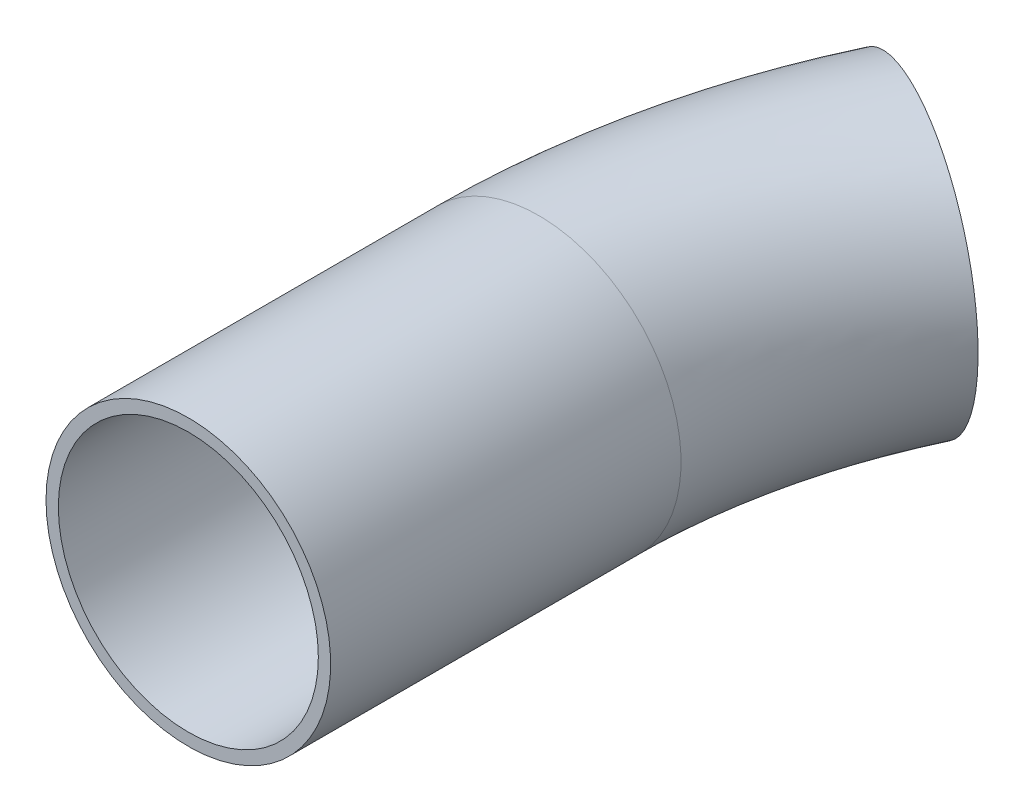
ISO-10303-21;
HEADER;
FILE_DESCRIPTION(('STEP AP214'),'2;1');
FILE_NAME('part.step','',(''),(''),'','','');
FILE_SCHEMA(('AUTOMOTIVE_DESIGN { 1 0 10303 214 1 1 1 1 }'));
ENDSEC;
DATA;
#1=APPLICATION_CONTEXT('core data for automotive mechanical design processes');
#2=APPLICATION_PROTOCOL_DEFINITION('international standard','automotive_design',2000,#1);
#3=PRODUCT_CONTEXT('',#1,'mechanical');
#4=PRODUCT('Part','Part','',(#3));
#5=PRODUCT_RELATED_PRODUCT_CATEGORY('part','',(#4));
#6=PRODUCT_DEFINITION_FORMATION('','',#4);
#7=PRODUCT_DEFINITION_CONTEXT('part definition',#1,'design');
#8=PRODUCT_DEFINITION('design','',#6,#7);
#9=PRODUCT_DEFINITION_SHAPE('','',#8);
#10=(LENGTH_UNIT() NAMED_UNIT(*) SI_UNIT(.MILLI.,.METRE.));
#11=(NAMED_UNIT(*) PLANE_ANGLE_UNIT() SI_UNIT($,.RADIAN.));
#12=(NAMED_UNIT(*) SI_UNIT($,.STERADIAN.) SOLID_ANGLE_UNIT());
#13=UNCERTAINTY_MEASURE_WITH_UNIT(LENGTH_MEASURE(1.E-05),#10,'distance_accuracy_value','');
#14=(GEOMETRIC_REPRESENTATION_CONTEXT(3) GLOBAL_UNCERTAINTY_ASSIGNED_CONTEXT((#13)) GLOBAL_UNIT_ASSIGNED_CONTEXT((#10,
#11,#12)) REPRESENTATION_CONTEXT('',''));
#15=CARTESIAN_POINT('',(0.,0.,0.));
#16=DIRECTION('',(0.,0.,1.));
#17=DIRECTION('',(1.,0.,0.));
#18=AXIS2_PLACEMENT_3D('',#15,#16,#17);
#19=CARTESIAN_POINT('',(95.7028457504537,0.,-72.2914605826834));
#20=DIRECTION('',(0.,-1.,0.));
#21=DIRECTION('',(0.,0.,-1.));
#22=AXIS2_PLACEMENT_3D('',#19,#20,#21);
#23=TOROIDAL_SURFACE('',#22,95.7028457504537,19.05);
#24=CARTESIAN_POINT('',(0.,0.,-72.2914605826834));
#25=DIRECTION('',(0.,0.,-1.));
#26=DIRECTION('',(-1.,0.,0.));
#27=AXIS2_PLACEMENT_3D('',#24,#25,#26);
#28=CIRCLE('',#27,19.05);
#29=CARTESIAN_POINT('',(-19.05,0.,-72.2914605826834));
#30=VERTEX_POINT('',#29);
#31=EDGE_CURVE('E44',#30,#30,#28,.T.);
#32=CARTESIAN_POINT('',(9.03733466226704,0.,-112.888552505117));
#33=DIRECTION('',(0.424199422745391,0.,-0.905568799011139));
#34=DIRECTION('',(-0.905568799011139,0.,-0.424199422745391));
#35=AXIS2_PLACEMENT_3D('',#32,#33,#34);
#36=CIRCLE('',#35,19.05);
#37=CARTESIAN_POINT('',(-8.21375095889516,0.,-120.969551508417));
#38=VERTEX_POINT('',#37);
#39=EDGE_CURVE('E10',#38,#38,#36,.T.);
#40=CARTESIAN_POINT('',(95.7028457504537,0.,-72.2914605826834));
#41=DIRECTION('',(0.,-1.,0.));
#42=DIRECTION('',(0.,0.,-1.));
#43=AXIS2_PLACEMENT_3D('',#40,#41,#42);
#44=CIRCLE('',#43,114.752845750454);
#45=EDGE_CURVE('',#30,#38,#44,.T.);
#46=ORIENTED_EDGE('',*,*,#31,.T.);
#47=ORIENTED_EDGE('',*,*,#39,.F.);
#48=ORIENTED_EDGE('',*,*,#45,.T.);
#49=ORIENTED_EDGE('',*,*,#45,.F.);
#50=EDGE_LOOP('',(#46,#48,#47,#49));
#51=FACE_BOUND('',#50,.T.);
#52=ADVANCED_FACE('F34',(#51),#23,.T.);
#53=CARTESIAN_POINT('',(95.7028457504537,0.,-72.2914605826834));
#54=DIRECTION('',(0.,-1.,0.));
#55=DIRECTION('',(0.,0.,-1.));
#56=AXIS2_PLACEMENT_3D('',#53,#54,#55);
#57=TOROIDAL_SURFACE('',#56,95.7028457504537,17.399);
#58=CARTESIAN_POINT('',(0.,0.,-72.2914605826834));
#59=DIRECTION('',(0.,0.,-1.));
#60=DIRECTION('',(-1.,0.,0.));
#61=AXIS2_PLACEMENT_3D('',#58,#59,#60);
#62=CIRCLE('',#61,17.399);
#63=CARTESIAN_POINT('',(-17.399,0.,-72.2914605826834));
#64=VERTEX_POINT('',#63);
#65=EDGE_CURVE('E48',#64,#64,#62,.T.);
#66=CARTESIAN_POINT('',(9.03733466226704,0.,-112.888552505117));
#67=DIRECTION('',(0.424199422745391,0.,-0.905568799011139));
#68=DIRECTION('',(-0.905568799011139,0.,-0.424199422745391));
#69=AXIS2_PLACEMENT_3D('',#66,#67,#68);
#70=CIRCLE('',#69,17.399);
#71=CARTESIAN_POINT('',(-6.71865687172778,0.,-120.269198261464));
#72=VERTEX_POINT('',#71);
#73=EDGE_CURVE('E40',#72,#72,#70,.T.);
#74=CARTESIAN_POINT('',(95.7028457504537,0.,-72.2914605826834));
#75=DIRECTION('',(0.,-1.,0.));
#76=DIRECTION('',(0.,0.,-1.));
#77=AXIS2_PLACEMENT_3D('',#74,#75,#76);
#78=CIRCLE('',#77,113.101845750454);
#79=EDGE_CURVE('',#64,#72,#78,.T.);
#80=ORIENTED_EDGE('',*,*,#65,.F.);
#81=ORIENTED_EDGE('',*,*,#73,.T.);
#82=ORIENTED_EDGE('',*,*,#79,.T.);
#83=ORIENTED_EDGE('',*,*,#79,.F.);
#84=EDGE_LOOP('',(#80,#82,#81,#83));
#85=FACE_BOUND('',#84,.T.);
#86=ADVANCED_FACE('F63',(#85),#57,.F.);
#87=CARTESIAN_POINT('',(0.,0.,-72.2914605826834));
#88=DIRECTION('',(0.,0.,1.));
#89=DIRECTION('',(1.,0.,0.));
#90=AXIS2_PLACEMENT_3D('',#87,#88,#89);
#91=CYLINDRICAL_SURFACE('',#90,17.399);
#92=ORIENTED_EDGE('',*,*,#65,.T.);
#93=EDGE_LOOP('',(#92));
#94=FACE_BOUND('',#93,.T.);
#95=CARTESIAN_POINT('',(0.,0.,-25.4));
#96=DIRECTION('',(0.,0.,-1.));
#97=DIRECTION('',(-1.,0.,0.));
#98=AXIS2_PLACEMENT_3D('',#95,#96,#97);
#99=CIRCLE('',#98,17.399);
#100=CARTESIAN_POINT('',(-17.399,0.,-25.4));
#101=VERTEX_POINT('',#100);
#102=EDGE_CURVE('E54',#101,#101,#99,.T.);
#103=ORIENTED_EDGE('',*,*,#102,.F.);
#104=EDGE_LOOP('',(#103));
#105=FACE_BOUND('',#104,.T.);
#106=ADVANCED_FACE('F60',(#94,#105),#91,.F.);
#107=CARTESIAN_POINT('',(0.,0.,-72.2914605826834));
#108=DIRECTION('',(0.,0.,1.));
#109=DIRECTION('',(1.,0.,0.));
#110=AXIS2_PLACEMENT_3D('',#107,#108,#109);
#111=CYLINDRICAL_SURFACE('',#110,19.05);
#112=ORIENTED_EDGE('',*,*,#31,.F.);
#113=EDGE_LOOP('',(#112));
#114=FACE_BOUND('',#113,.T.);
#115=CARTESIAN_POINT('',(0.,0.,-25.4));
#116=DIRECTION('',(0.,0.,-1.));
#117=DIRECTION('',(-1.,0.,0.));
#118=AXIS2_PLACEMENT_3D('',#115,#116,#117);
#119=CIRCLE('',#118,19.05);
#120=CARTESIAN_POINT('',(-19.05,0.,-25.4));
#121=VERTEX_POINT('',#120);
#122=EDGE_CURVE('E51',#121,#121,#119,.T.);
#123=ORIENTED_EDGE('',*,*,#122,.T.);
#124=EDGE_LOOP('',(#123));
#125=FACE_BOUND('',#124,.T.);
#126=ADVANCED_FACE('F69',(#114,#125),#111,.T.);
#127=CARTESIAN_POINT('',(9.03733466226704,0.,-112.888552505117));
#128=DIRECTION('',(0.424199422745391,0.,-0.905568799011139));
#129=DIRECTION('',(-0.905568799011139,0.,-0.424199422745391));
#130=AXIS2_PLACEMENT_3D('',#127,#128,#129);
#131=PLANE('',#130);
#132=ORIENTED_EDGE('',*,*,#73,.F.);
#133=EDGE_LOOP('',(#132));
#134=FACE_BOUND('',#133,.T.);
#135=ORIENTED_EDGE('',*,*,#39,.T.);
#136=EDGE_LOOP('',(#135));
#137=FACE_BOUND('',#136,.T.);
#138=ADVANCED_FACE('F75',(#134,#137),#131,.T.);
#139=CARTESIAN_POINT('',(0.,0.,-25.4));
#140=DIRECTION('',(0.,0.,-1.));
#141=DIRECTION('',(-1.,0.,0.));
#142=AXIS2_PLACEMENT_3D('',#139,#140,#141);
#143=PLANE('',#142);
#144=ORIENTED_EDGE('',*,*,#102,.T.);
#145=EDGE_LOOP('',(#144));
#146=FACE_BOUND('',#145,.T.);
#147=ORIENTED_EDGE('',*,*,#122,.F.);
#148=EDGE_LOOP('',(#147));
#149=FACE_BOUND('',#148,.T.);
#150=ADVANCED_FACE('F77',(#146,#149),#143,.F.);
#151=CLOSED_SHELL('',(#52,#86,#106,#126,#138,#150));
#152=MANIFOLD_SOLID_BREP('B2',#151);
#153=ADVANCED_BREP_SHAPE_REPRESENTATION('',(#18,#152),#14);
#154=SHAPE_DEFINITION_REPRESENTATION(#9,#153);
ENDSEC;
END-ISO-10303-21;
